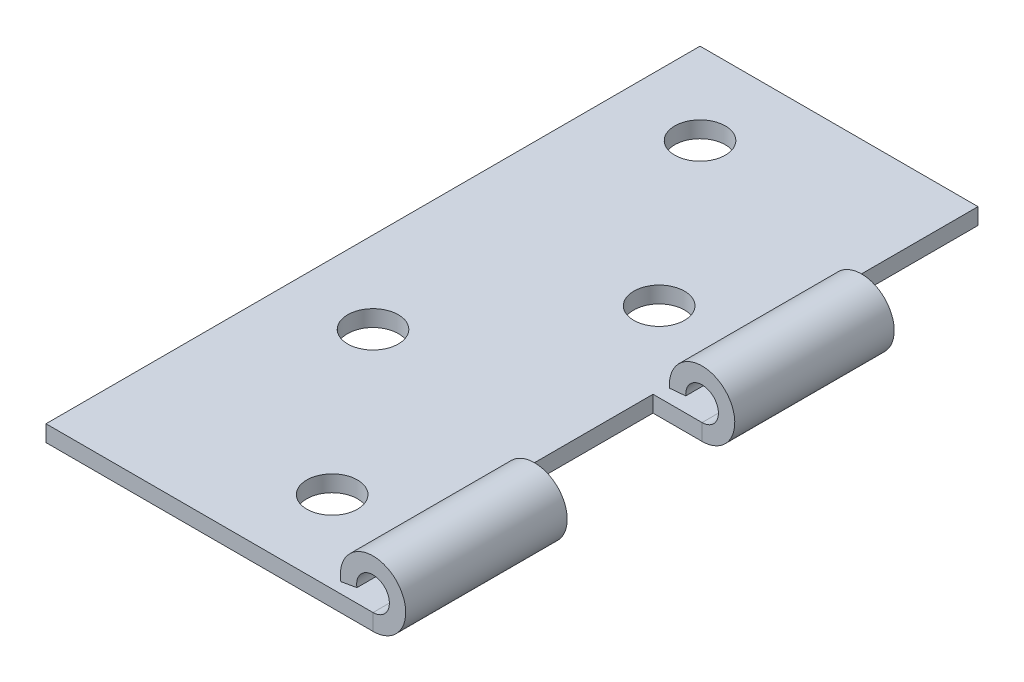
ISO-10303-21;
HEADER;
FILE_DESCRIPTION(('STEP AP214'),'2;1');
FILE_NAME('part.step','',(''),(''),'','','');
FILE_SCHEMA(('AUTOMOTIVE_DESIGN { 1 0 10303 214 1 1 1 1 }'));
ENDSEC;
DATA;
#1=APPLICATION_CONTEXT('core data for automotive mechanical design processes');
#2=APPLICATION_PROTOCOL_DEFINITION('international standard','automotive_design',2000,#1);
#3=PRODUCT_CONTEXT('',#1,'mechanical');
#4=PRODUCT('Part','Part','',(#3));
#5=PRODUCT_RELATED_PRODUCT_CATEGORY('part','',(#4));
#6=PRODUCT_DEFINITION_FORMATION('','',#4);
#7=PRODUCT_DEFINITION_CONTEXT('part definition',#1,'design');
#8=PRODUCT_DEFINITION('design','',#6,#7);
#9=PRODUCT_DEFINITION_SHAPE('','',#8);
#10=(LENGTH_UNIT() NAMED_UNIT(*) SI_UNIT(.MILLI.,.METRE.));
#11=(NAMED_UNIT(*) PLANE_ANGLE_UNIT() SI_UNIT($,.RADIAN.));
#12=(NAMED_UNIT(*) SI_UNIT($,.STERADIAN.) SOLID_ANGLE_UNIT());
#13=UNCERTAINTY_MEASURE_WITH_UNIT(LENGTH_MEASURE(1.E-05),#10,'distance_accuracy_value','');
#14=(GEOMETRIC_REPRESENTATION_CONTEXT(3) GLOBAL_UNCERTAINTY_ASSIGNED_CONTEXT((#13)) GLOBAL_UNIT_ASSIGNED_CONTEXT((#10,
#11,#12)) REPRESENTATION_CONTEXT('',''));
#15=CARTESIAN_POINT('',(0.,0.,0.));
#16=DIRECTION('',(0.,0.,1.));
#17=DIRECTION('',(1.,0.,0.));
#18=AXIS2_PLACEMENT_3D('',#15,#16,#17);
#19=CARTESIAN_POINT('',(-20.,-1.,40.));
#20=DIRECTION('',(0.,1.,0.));
#21=DIRECTION('',(0.,0.,1.));
#22=AXIS2_PLACEMENT_3D('',#19,#20,#21);
#23=PLANE('',#22);
#24=CARTESIAN_POINT('',(-10.,-1.,-30.));
#25=DIRECTION('',(0.,1.,0.));
#26=DIRECTION('',(0.,0.,1.));
#27=AXIS2_PLACEMENT_3D('',#24,#25,#26);
#28=CIRCLE('',#27,3.1);
#29=CARTESIAN_POINT('',(-10.,-1.,-26.9));
#30=VERTEX_POINT('',#29);
#31=EDGE_CURVE('E323',#30,#30,#28,.T.);
#32=ORIENTED_EDGE('',*,*,#31,.T.);
#33=EDGE_LOOP('',(#32));
#34=FACE_BOUND('',#33,.T.);
#35=CARTESIAN_POINT('',(5.,-1.,-10.));
#36=DIRECTION('',(0.,1.,0.));
#37=DIRECTION('',(0.,0.,1.));
#38=AXIS2_PLACEMENT_3D('',#35,#36,#37);
#39=CIRCLE('',#38,3.1);
#40=CARTESIAN_POINT('',(5.,-1.,-6.9));
#41=VERTEX_POINT('',#40);
#42=EDGE_CURVE('E317',#41,#41,#39,.T.);
#43=ORIENTED_EDGE('',*,*,#42,.T.);
#44=EDGE_LOOP('',(#43));
#45=FACE_BOUND('',#44,.T.);
#46=CARTESIAN_POINT('',(-10.,-1.,10.));
#47=DIRECTION('',(0.,1.,0.));
#48=DIRECTION('',(0.,0.,1.));
#49=AXIS2_PLACEMENT_3D('',#46,#47,#48);
#50=CIRCLE('',#49,3.1);
#51=CARTESIAN_POINT('',(-10.,-1.,13.1));
#52=VERTEX_POINT('',#51);
#53=EDGE_CURVE('E311',#52,#52,#50,.T.);
#54=ORIENTED_EDGE('',*,*,#53,.T.);
#55=EDGE_LOOP('',(#54));
#56=FACE_BOUND('',#55,.T.);
#57=CARTESIAN_POINT('',(5.,-1.,30.));
#58=DIRECTION('',(0.,1.,0.));
#59=DIRECTION('',(0.,0.,1.));
#60=AXIS2_PLACEMENT_3D('',#57,#58,#59);
#61=CIRCLE('',#60,3.1);
#62=CARTESIAN_POINT('',(5.,-1.,33.1));
#63=VERTEX_POINT('',#62);
#64=EDGE_CURVE('E291',#63,#63,#61,.T.);
#65=ORIENTED_EDGE('',*,*,#64,.T.);
#66=EDGE_LOOP('',(#65));
#67=FACE_BOUND('',#66,.T.);
#68=DIRECTION('',(0.,0.,1.));
#69=VECTOR('',#68,1.);
#70=CARTESIAN_POINT('',(14.,-1.,20.25));
#71=LINE('',#70,#69);
#72=CARTESIAN_POINT('',(14.,-1.,-0.249999999999999));
#73=VERTEX_POINT('',#72);
#74=CARTESIAN_POINT('',(14.,-1.,20.25));
#75=VERTEX_POINT('',#74);
#76=EDGE_CURVE('E303',#73,#75,#71,.T.);
#77=ORIENTED_EDGE('',*,*,#76,.T.);
#78=DIRECTION('',(1.,0.,0.));
#79=VECTOR('',#78,1.);
#80=CARTESIAN_POINT('',(20.,-1.,20.25));
#81=LINE('',#80,#79);
#82=CARTESIAN_POINT('',(20.,-1.,20.25));
#83=VERTEX_POINT('',#82);
#84=EDGE_CURVE('E170',#75,#83,#81,.T.);
#85=ORIENTED_EDGE('',*,*,#84,.T.);
#86=DIRECTION('',(0.,0.,-1.));
#87=VECTOR('',#86,1.);
#88=CARTESIAN_POINT('',(20.,-1.,40.));
#89=LINE('',#88,#87);
#90=CARTESIAN_POINT('',(20.,-1.,40.));
#91=VERTEX_POINT('',#90);
#92=EDGE_CURVE('E11',#91,#83,#89,.T.);
#93=ORIENTED_EDGE('',*,*,#92,.F.);
#94=DIRECTION('',(1.,0.,0.));
#95=VECTOR('',#94,1.);
#96=CARTESIAN_POINT('',(-20.,-1.,40.));
#97=LINE('',#96,#95);
#98=CARTESIAN_POINT('',(-20.,-1.,40.));
#99=VERTEX_POINT('',#98);
#100=EDGE_CURVE('E132',#99,#91,#97,.T.);
#101=ORIENTED_EDGE('',*,*,#100,.F.);
#102=DIRECTION('',(0.,0.,-1.));
#103=VECTOR('',#102,1.);
#104=CARTESIAN_POINT('',(-20.,-1.,40.));
#105=LINE('',#104,#103);
#106=CARTESIAN_POINT('',(-20.,-1.,-40.));
#107=VERTEX_POINT('',#106);
#108=EDGE_CURVE('E59',#99,#107,#105,.T.);
#109=ORIENTED_EDGE('',*,*,#108,.T.);
#110=DIRECTION('',(1.,0.,0.));
#111=VECTOR('',#110,1.);
#112=CARTESIAN_POINT('',(-20.,-1.,-40.));
#113=LINE('',#112,#111);
#114=CARTESIAN_POINT('',(14.,-1.,-40.));
#115=VERTEX_POINT('',#114);
#116=EDGE_CURVE('E109',#107,#115,#113,.T.);
#117=ORIENTED_EDGE('',*,*,#116,.T.);
#118=DIRECTION('',(0.,0.,1.));
#119=VECTOR('',#118,1.);
#120=CARTESIAN_POINT('',(14.,-1.,-40.));
#121=LINE('',#120,#119);
#122=CARTESIAN_POINT('',(14.,-1.,-19.75));
#123=VERTEX_POINT('',#122);
#124=EDGE_CURVE('E280',#115,#123,#121,.T.);
#125=ORIENTED_EDGE('',*,*,#124,.T.);
#126=DIRECTION('',(1.,0.,0.));
#127=VECTOR('',#126,1.);
#128=CARTESIAN_POINT('',(20.,-1.,-19.75));
#129=LINE('',#128,#127);
#130=CARTESIAN_POINT('',(20.,-1.,-19.75));
#131=VERTEX_POINT('',#130);
#132=EDGE_CURVE('E279',#123,#131,#129,.T.);
#133=ORIENTED_EDGE('',*,*,#132,.T.);
#134=DIRECTION('',(0.,0.,-1.));
#135=VECTOR('',#134,1.);
#136=CARTESIAN_POINT('',(20.,-1.,-19.75));
#137=LINE('',#136,#135);
#138=CARTESIAN_POINT('',(20.,-1.,-0.25));
#139=VERTEX_POINT('',#138);
#140=EDGE_CURVE('E263',#131,#139,#137,.F.);
#141=ORIENTED_EDGE('',*,*,#140,.T.);
#142=DIRECTION('',(-1.,0.,0.));
#143=VECTOR('',#142,1.);
#144=CARTESIAN_POINT('',(20.,-1.,-0.25));
#145=LINE('',#144,#143);
#146=EDGE_CURVE('E277',#139,#73,#145,.T.);
#147=ORIENTED_EDGE('',*,*,#146,.T.);
#148=EDGE_LOOP('',(#77,#85,#93,#101,#109,#117,#125,#133,#141,#147));
#149=FACE_BOUND('',#148,.T.);
#150=ADVANCED_FACE('F43',(#34,#45,#56,#67,#149),#23,.F.);
#151=CARTESIAN_POINT('',(-20.,1.,40.));
#152=DIRECTION('',(0.,1.,0.));
#153=DIRECTION('',(0.,0.,1.));
#154=AXIS2_PLACEMENT_3D('',#151,#152,#153);
#155=PLANE('',#154);
#156=CARTESIAN_POINT('',(-10.,1.,-30.));
#157=DIRECTION('',(0.,1.,0.));
#158=DIRECTION('',(0.,0.,1.));
#159=AXIS2_PLACEMENT_3D('',#156,#157,#158);
#160=CIRCLE('',#159,3.1);
#161=CARTESIAN_POINT('',(-10.,1.,-26.9));
#162=VERTEX_POINT('',#161);
#163=EDGE_CURVE('E326',#162,#162,#160,.T.);
#164=ORIENTED_EDGE('',*,*,#163,.F.);
#165=EDGE_LOOP('',(#164));
#166=FACE_BOUND('',#165,.T.);
#167=CARTESIAN_POINT('',(5.,1.,-10.));
#168=DIRECTION('',(0.,1.,0.));
#169=DIRECTION('',(0.,0.,1.));
#170=AXIS2_PLACEMENT_3D('',#167,#168,#169);
#171=CIRCLE('',#170,3.1);
#172=CARTESIAN_POINT('',(5.,1.,-6.9));
#173=VERTEX_POINT('',#172);
#174=EDGE_CURVE('E320',#173,#173,#171,.T.);
#175=ORIENTED_EDGE('',*,*,#174,.F.);
#176=EDGE_LOOP('',(#175));
#177=FACE_BOUND('',#176,.T.);
#178=CARTESIAN_POINT('',(-10.,1.,10.));
#179=DIRECTION('',(0.,1.,0.));
#180=DIRECTION('',(0.,0.,1.));
#181=AXIS2_PLACEMENT_3D('',#178,#179,#180);
#182=CIRCLE('',#181,3.1);
#183=CARTESIAN_POINT('',(-10.,1.,13.1));
#184=VERTEX_POINT('',#183);
#185=EDGE_CURVE('E314',#184,#184,#182,.T.);
#186=ORIENTED_EDGE('',*,*,#185,.F.);
#187=EDGE_LOOP('',(#186));
#188=FACE_BOUND('',#187,.T.);
#189=CARTESIAN_POINT('',(5.,1.,30.));
#190=DIRECTION('',(0.,1.,0.));
#191=DIRECTION('',(0.,0.,1.));
#192=AXIS2_PLACEMENT_3D('',#189,#190,#191);
#193=CIRCLE('',#192,3.1);
#194=CARTESIAN_POINT('',(5.,1.,33.1));
#195=VERTEX_POINT('',#194);
#196=EDGE_CURVE('E308',#195,#195,#193,.T.);
#197=ORIENTED_EDGE('',*,*,#196,.F.);
#198=EDGE_LOOP('',(#197));
#199=FACE_BOUND('',#198,.T.);
#200=DIRECTION('',(1.,0.,0.));
#201=VECTOR('',#200,1.);
#202=CARTESIAN_POINT('',(20.,1.,20.25));
#203=LINE('',#202,#201);
#204=CARTESIAN_POINT('',(14.,1.,20.25));
#205=VERTEX_POINT('',#204);
#206=CARTESIAN_POINT('',(20.,1.,20.25));
#207=VERTEX_POINT('',#206);
#208=EDGE_CURVE('E156',#205,#207,#203,.T.);
#209=ORIENTED_EDGE('',*,*,#208,.F.);
#210=DIRECTION('',(0.,0.,1.));
#211=VECTOR('',#210,1.);
#212=CARTESIAN_POINT('',(14.,1.,20.25));
#213=LINE('',#212,#211);
#214=CARTESIAN_POINT('',(14.,1.,-0.249999999999999));
#215=VERTEX_POINT('',#214);
#216=EDGE_CURVE('E297',#215,#205,#213,.T.);
#217=ORIENTED_EDGE('',*,*,#216,.F.);
#218=DIRECTION('',(-1.,0.,0.));
#219=VECTOR('',#218,1.);
#220=CARTESIAN_POINT('',(20.,1.,-0.25));
#221=LINE('',#220,#219);
#222=CARTESIAN_POINT('',(20.,1.,-0.25));
#223=VERTEX_POINT('',#222);
#224=EDGE_CURVE('E289',#223,#215,#221,.T.);
#225=ORIENTED_EDGE('',*,*,#224,.F.);
#226=DIRECTION('',(0.,0.,-1.));
#227=VECTOR('',#226,1.);
#228=CARTESIAN_POINT('',(20.,1.,-19.75));
#229=LINE('',#228,#227);
#230=CARTESIAN_POINT('',(20.,1.,-19.75));
#231=VERTEX_POINT('',#230);
#232=EDGE_CURVE('E248',#231,#223,#229,.F.);
#233=ORIENTED_EDGE('',*,*,#232,.F.);
#234=DIRECTION('',(1.,0.,0.));
#235=VECTOR('',#234,1.);
#236=CARTESIAN_POINT('',(20.,1.,-19.75));
#237=LINE('',#236,#235);
#238=CARTESIAN_POINT('',(14.,1.,-19.75));
#239=VERTEX_POINT('',#238);
#240=EDGE_CURVE('E218',#239,#231,#237,.T.);
#241=ORIENTED_EDGE('',*,*,#240,.F.);
#242=DIRECTION('',(0.,0.,1.));
#243=VECTOR('',#242,1.);
#244=CARTESIAN_POINT('',(14.,1.,-40.));
#245=LINE('',#244,#243);
#246=CARTESIAN_POINT('',(14.,1.,-40.));
#247=VERTEX_POINT('',#246);
#248=EDGE_CURVE('E286',#247,#239,#245,.T.);
#249=ORIENTED_EDGE('',*,*,#248,.F.);
#250=DIRECTION('',(1.,0.,0.));
#251=VECTOR('',#250,1.);
#252=CARTESIAN_POINT('',(-20.,1.,-40.));
#253=LINE('',#252,#251);
#254=CARTESIAN_POINT('',(-20.,1.,-40.));
#255=VERTEX_POINT('',#254);
#256=EDGE_CURVE('E144',#255,#247,#253,.T.);
#257=ORIENTED_EDGE('',*,*,#256,.F.);
#258=DIRECTION('',(0.,0.,-1.));
#259=VECTOR('',#258,1.);
#260=CARTESIAN_POINT('',(-20.,1.,40.));
#261=LINE('',#260,#259);
#262=CARTESIAN_POINT('',(-20.,1.,40.));
#263=VERTEX_POINT('',#262);
#264=EDGE_CURVE('E67',#263,#255,#261,.T.);
#265=ORIENTED_EDGE('',*,*,#264,.F.);
#266=DIRECTION('',(1.,0.,0.));
#267=VECTOR('',#266,1.);
#268=CARTESIAN_POINT('',(-20.,1.,40.));
#269=LINE('',#268,#267);
#270=CARTESIAN_POINT('',(20.,0.999999999999998,40.));
#271=VERTEX_POINT('',#270);
#272=EDGE_CURVE('E137',#263,#271,#269,.T.);
#273=ORIENTED_EDGE('',*,*,#272,.T.);
#274=DIRECTION('',(0.,0.,-1.));
#275=VECTOR('',#274,1.);
#276=CARTESIAN_POINT('',(20.,1.,40.));
#277=LINE('',#276,#275);
#278=EDGE_CURVE('E51',#271,#207,#277,.T.);
#279=ORIENTED_EDGE('',*,*,#278,.T.);
#280=EDGE_LOOP('',(#209,#217,#225,#233,#241,#249,#257,#265,#273,#279));
#281=FACE_BOUND('',#280,.T.);
#282=ADVANCED_FACE('F152',(#166,#177,#188,#199,#281),#155,.T.);
#283=CARTESIAN_POINT('',(-20.,-1.,40.));
#284=DIRECTION('',(-1.,0.,0.));
#285=DIRECTION('',(0.,0.,1.));
#286=AXIS2_PLACEMENT_3D('',#283,#284,#285);
#287=PLANE('',#286);
#288=DIRECTION('',(0.,1.,0.));
#289=VECTOR('',#288,1.);
#290=CARTESIAN_POINT('',(-20.,-1.,-40.));
#291=LINE('',#290,#289);
#292=EDGE_CURVE('E135',#107,#255,#291,.T.);
#293=ORIENTED_EDGE('',*,*,#292,.F.);
#294=ORIENTED_EDGE('',*,*,#108,.F.);
#295=DIRECTION('',(0.,1.,0.));
#296=VECTOR('',#295,1.);
#297=CARTESIAN_POINT('',(-20.,-1.,40.));
#298=LINE('',#297,#296);
#299=EDGE_CURVE('E140',#99,#263,#298,.T.);
#300=ORIENTED_EDGE('',*,*,#299,.T.);
#301=ORIENTED_EDGE('',*,*,#264,.T.);
#302=EDGE_LOOP('',(#293,#294,#300,#301));
#303=FACE_BOUND('',#302,.T.);
#304=ADVANCED_FACE('F334',(#303),#287,.T.);
#305=CARTESIAN_POINT('',(0.,0.,40.));
#306=DIRECTION('',(0.,0.,-1.));
#307=DIRECTION('',(-1.,0.,0.));
#308=AXIS2_PLACEMENT_3D('',#305,#306,#307);
#309=PLANE('',#308);
#310=ORIENTED_EDGE('',*,*,#100,.T.);
#311=DIRECTION('',(0.,-1.,0.));
#312=VECTOR('',#311,1.);
#313=CARTESIAN_POINT('',(20.,1.,40.));
#314=LINE('',#313,#312);
#315=EDGE_CURVE('E76',#271,#91,#314,.T.);
#316=ORIENTED_EDGE('',*,*,#315,.F.);
#317=ORIENTED_EDGE('',*,*,#272,.F.);
#318=ORIENTED_EDGE('',*,*,#299,.F.);
#319=EDGE_LOOP('',(#310,#316,#317,#318));
#320=FACE_BOUND('',#319,.T.);
#321=ADVANCED_FACE('F162',(#320),#309,.F.);
#322=CARTESIAN_POINT('',(0.,0.,-40.));
#323=DIRECTION('',(0.,0.,-1.));
#324=DIRECTION('',(-1.,0.,0.));
#325=AXIS2_PLACEMENT_3D('',#322,#323,#324);
#326=PLANE('',#325);
#327=DIRECTION('',(0.,1.,0.));
#328=VECTOR('',#327,1.);
#329=CARTESIAN_POINT('',(14.,-1.,-40.));
#330=LINE('',#329,#328);
#331=EDGE_CURVE('E281',#115,#247,#330,.T.);
#332=ORIENTED_EDGE('',*,*,#331,.F.);
#333=ORIENTED_EDGE('',*,*,#116,.F.);
#334=ORIENTED_EDGE('',*,*,#292,.T.);
#335=ORIENTED_EDGE('',*,*,#256,.T.);
#336=EDGE_LOOP('',(#332,#333,#334,#335));
#337=FACE_BOUND('',#336,.T.);
#338=ADVANCED_FACE('F535',(#337),#326,.T.);
#339=CARTESIAN_POINT('',(18.0303844939756,2.65270364466612,30.125));
#340=DIRECTION('',(-0.173648177666941,0.984807753012206,0.));
#341=DIRECTION('',(0.,0.,-1.));
#342=AXIS2_PLACEMENT_3D('',#339,#340,#341);
#343=PLANE('',#342);
#344=DIRECTION('',(-0.984807753012206,-0.173648177666941,0.));
#345=VECTOR('',#344,1.);
#346=CARTESIAN_POINT('',(18.0303844939756,2.65270364466612,20.25));
#347=LINE('',#346,#345);
#348=CARTESIAN_POINT('',(18.0303844939756,2.65270364466612,20.25));
#349=VERTEX_POINT('',#348);
#350=CARTESIAN_POINT('',(16.0607689879512,2.30540728933223,20.25));
#351=VERTEX_POINT('',#350);
#352=EDGE_CURVE('E98',#349,#351,#347,.T.);
#353=ORIENTED_EDGE('',*,*,#352,.F.);
#354=DIRECTION('',(0.,0.,-1.));
#355=VECTOR('',#354,1.);
#356=CARTESIAN_POINT('',(18.0303844939756,2.65270364466612,20.25));
#357=LINE('',#356,#355);
#358=CARTESIAN_POINT('',(18.0303844939756,2.65270364466612,40.));
#359=VERTEX_POINT('',#358);
#360=EDGE_CURVE('E101',#359,#349,#357,.T.);
#361=ORIENTED_EDGE('',*,*,#360,.F.);
#362=DIRECTION('',(-0.984807753012206,-0.173648177666941,0.));
#363=VECTOR('',#362,1.);
#364=CARTESIAN_POINT('',(18.0303844939756,2.65270364466612,40.));
#365=LINE('',#364,#363);
#366=CARTESIAN_POINT('',(16.0607689879512,2.30540728933223,40.));
#367=VERTEX_POINT('',#366);
#368=EDGE_CURVE('E110',#359,#367,#365,.T.);
#369=ORIENTED_EDGE('',*,*,#368,.T.);
#370=DIRECTION('',(0.,0.,-1.));
#371=VECTOR('',#370,1.);
#372=CARTESIAN_POINT('',(16.0607689879512,2.30540728933223,20.25));
#373=LINE('',#372,#371);
#374=EDGE_CURVE('E104',#367,#351,#373,.T.);
#375=ORIENTED_EDGE('',*,*,#374,.T.);
#376=EDGE_LOOP('',(#353,#361,#369,#375));
#377=FACE_BOUND('',#376,.T.);
#378=ADVANCED_FACE('F100',(#377),#343,.F.);
#379=CARTESIAN_POINT('',(20.,3.,40.));
#380=DIRECTION('',(0.,0.,1.));
#381=DIRECTION('',(1.,0.,0.));
#382=AXIS2_PLACEMENT_3D('',#379,#380,#381);
#383=PLANE('',#382);
#384=ORIENTED_EDGE('',*,*,#368,.F.);
#385=CARTESIAN_POINT('',(20.,3.,40.));
#386=DIRECTION('',(0.,0.,-1.));
#387=DIRECTION('',(-1.,0.,0.));
#388=AXIS2_PLACEMENT_3D('',#385,#386,#387);
#389=CIRCLE('',#388,2.);
#390=EDGE_CURVE('E118',#271,#359,#389,.F.);
#391=ORIENTED_EDGE('',*,*,#390,.F.);
#392=ORIENTED_EDGE('',*,*,#315,.T.);
#393=CARTESIAN_POINT('',(20.,3.,40.));
#394=DIRECTION('',(0.,0.,-1.));
#395=DIRECTION('',(-1.,0.,0.));
#396=AXIS2_PLACEMENT_3D('',#393,#394,#395);
#397=CIRCLE('',#396,4.);
#398=EDGE_CURVE('E131',#91,#367,#397,.F.);
#399=ORIENTED_EDGE('',*,*,#398,.T.);
#400=EDGE_LOOP('',(#384,#391,#392,#399));
#401=FACE_BOUND('',#400,.T.);
#402=ADVANCED_FACE('F160',(#401),#383,.T.);
#403=CARTESIAN_POINT('',(20.,3.,20.25));
#404=DIRECTION('',(0.,0.,1.));
#405=DIRECTION('',(1.,0.,0.));
#406=AXIS2_PLACEMENT_3D('',#403,#404,#405);
#407=PLANE('',#406);
#408=CARTESIAN_POINT('',(20.,3.,20.25));
#409=DIRECTION('',(0.,0.,-1.));
#410=DIRECTION('',(-1.,0.,0.));
#411=AXIS2_PLACEMENT_3D('',#408,#409,#410);
#412=CIRCLE('',#411,2.);
#413=EDGE_CURVE('E116',#349,#207,#412,.T.);
#414=ORIENTED_EDGE('',*,*,#413,.F.);
#415=ORIENTED_EDGE('',*,*,#352,.T.);
#416=CARTESIAN_POINT('',(20.,3.,20.25));
#417=DIRECTION('',(0.,0.,-1.));
#418=DIRECTION('',(-1.,0.,0.));
#419=AXIS2_PLACEMENT_3D('',#416,#417,#418);
#420=CIRCLE('',#419,4.);
#421=EDGE_CURVE('E173',#351,#83,#420,.T.);
#422=ORIENTED_EDGE('',*,*,#421,.T.);
#423=DIRECTION('',(0.,-1.,0.));
#424=VECTOR('',#423,1.);
#425=CARTESIAN_POINT('',(20.,0.999999999999998,20.25));
#426=LINE('',#425,#424);
#427=EDGE_CURVE('E124',#207,#83,#426,.T.);
#428=ORIENTED_EDGE('',*,*,#427,.F.);
#429=EDGE_LOOP('',(#414,#415,#422,#428));
#430=FACE_BOUND('',#429,.T.);
#431=ADVANCED_FACE('F122',(#430),#407,.F.);
#432=CARTESIAN_POINT('',(20.,3.,20.25));
#433=DIRECTION('',(0.,0.,-1.));
#434=DIRECTION('',(-0.984807753012206,-0.173648177666941,0.));
#435=AXIS2_PLACEMENT_3D('',#432,#433,#434);
#436=CYLINDRICAL_SURFACE('',#435,4.);
#437=ORIENTED_EDGE('',*,*,#92,.T.);
#438=ORIENTED_EDGE('',*,*,#421,.F.);
#439=ORIENTED_EDGE('',*,*,#374,.F.);
#440=ORIENTED_EDGE('',*,*,#398,.F.);
#441=EDGE_LOOP('',(#437,#438,#439,#440));
#442=FACE_BOUND('',#441,.T.);
#443=ADVANCED_FACE('F172',(#442),#436,.T.);
#444=CARTESIAN_POINT('',(20.,3.,20.25));
#445=DIRECTION('',(0.,0.,-1.));
#446=DIRECTION('',(-0.984807753012206,-0.173648177666941,0.));
#447=AXIS2_PLACEMENT_3D('',#444,#445,#446);
#448=CYLINDRICAL_SURFACE('',#447,2.);
#449=ORIENTED_EDGE('',*,*,#278,.F.);
#450=ORIENTED_EDGE('',*,*,#390,.T.);
#451=ORIENTED_EDGE('',*,*,#360,.T.);
#452=ORIENTED_EDGE('',*,*,#413,.T.);
#453=EDGE_LOOP('',(#449,#450,#451,#452));
#454=FACE_BOUND('',#453,.T.);
#455=ADVANCED_FACE('F114',(#454),#448,.F.);
#456=CARTESIAN_POINT('',(18.0076106038165,2.82568851450466,-10.));
#457=DIRECTION('',(-0.0871557427476685,0.996194698091745,0.));
#458=DIRECTION('',(0.,0.,-1.));
#459=AXIS2_PLACEMENT_3D('',#456,#457,#458);
#460=PLANE('',#459);
#461=DIRECTION('',(-0.996194698091745,-0.0871557427476685,0.));
#462=VECTOR('',#461,1.);
#463=CARTESIAN_POINT('',(18.0076106038165,2.82568851450466,-19.75));
#464=LINE('',#463,#462);
#465=CARTESIAN_POINT('',(18.0076106038165,2.82568851450466,-19.75));
#466=VERTEX_POINT('',#465);
#467=CARTESIAN_POINT('',(16.015221207633,2.65137702900933,-19.75));
#468=VERTEX_POINT('',#467);
#469=EDGE_CURVE('E119',#466,#468,#464,.T.);
#470=ORIENTED_EDGE('',*,*,#469,.F.);
#471=DIRECTION('',(0.,0.,-1.));
#472=VECTOR('',#471,1.);
#473=CARTESIAN_POINT('',(18.0076106038165,2.82568851450466,-19.75));
#474=LINE('',#473,#472);
#475=CARTESIAN_POINT('',(18.0076106038165,2.82568851450466,-0.25));
#476=VERTEX_POINT('',#475);
#477=EDGE_CURVE('E226',#476,#466,#474,.T.);
#478=ORIENTED_EDGE('',*,*,#477,.F.);
#479=DIRECTION('',(-0.996194698091745,-0.0871557427476685,0.));
#480=VECTOR('',#479,1.);
#481=CARTESIAN_POINT('',(18.0076106038165,2.82568851450466,-0.25));
#482=LINE('',#481,#480);
#483=CARTESIAN_POINT('',(16.015221207633,2.65137702900933,-0.25));
#484=VERTEX_POINT('',#483);
#485=EDGE_CURVE('E234',#476,#484,#482,.T.);
#486=ORIENTED_EDGE('',*,*,#485,.T.);
#487=DIRECTION('',(0.,0.,-1.));
#488=VECTOR('',#487,1.);
#489=CARTESIAN_POINT('',(16.015221207633,2.65137702900933,-19.75));
#490=LINE('',#489,#488);
#491=EDGE_CURVE('E229',#484,#468,#490,.T.);
#492=ORIENTED_EDGE('',*,*,#491,.T.);
#493=EDGE_LOOP('',(#470,#478,#486,#492));
#494=FACE_BOUND('',#493,.T.);
#495=ADVANCED_FACE('F225',(#494),#460,.F.);
#496=CARTESIAN_POINT('',(20.,3.,-0.25));
#497=DIRECTION('',(0.,0.,1.));
#498=DIRECTION('',(1.,0.,0.));
#499=AXIS2_PLACEMENT_3D('',#496,#497,#498);
#500=PLANE('',#499);
#501=ORIENTED_EDGE('',*,*,#485,.F.);
#502=CARTESIAN_POINT('',(20.,3.,-0.25));
#503=DIRECTION('',(0.,0.,-1.));
#504=DIRECTION('',(-1.,0.,0.));
#505=AXIS2_PLACEMENT_3D('',#502,#503,#504);
#506=CIRCLE('',#505,2.);
#507=EDGE_CURVE('E243',#223,#476,#506,.F.);
#508=ORIENTED_EDGE('',*,*,#507,.F.);
#509=DIRECTION('',(0.,-1.,0.));
#510=VECTOR('',#509,1.);
#511=CARTESIAN_POINT('',(20.,1.,-0.25));
#512=LINE('',#511,#510);
#513=EDGE_CURVE('E253',#223,#139,#512,.T.);
#514=ORIENTED_EDGE('',*,*,#513,.T.);
#515=CARTESIAN_POINT('',(20.,3.,-0.25));
#516=DIRECTION('',(0.,0.,-1.));
#517=DIRECTION('',(-1.,0.,0.));
#518=AXIS2_PLACEMENT_3D('',#515,#516,#517);
#519=CIRCLE('',#518,4.);
#520=EDGE_CURVE('E258',#139,#484,#519,.F.);
#521=ORIENTED_EDGE('',*,*,#520,.T.);
#522=EDGE_LOOP('',(#501,#508,#514,#521));
#523=FACE_BOUND('',#522,.T.);
#524=ADVANCED_FACE('F470',(#523),#500,.T.);
#525=CARTESIAN_POINT('',(20.,3.,-19.75));
#526=DIRECTION('',(0.,0.,1.));
#527=DIRECTION('',(1.,0.,0.));
#528=AXIS2_PLACEMENT_3D('',#525,#526,#527);
#529=PLANE('',#528);
#530=CARTESIAN_POINT('',(20.,3.,-19.75));
#531=DIRECTION('',(0.,0.,-1.));
#532=DIRECTION('',(-1.,0.,0.));
#533=AXIS2_PLACEMENT_3D('',#530,#531,#532);
#534=CIRCLE('',#533,2.);
#535=EDGE_CURVE('E240',#466,#231,#534,.T.);
#536=ORIENTED_EDGE('',*,*,#535,.F.);
#537=ORIENTED_EDGE('',*,*,#469,.T.);
#538=CARTESIAN_POINT('',(20.,3.,-19.75));
#539=DIRECTION('',(0.,0.,-1.));
#540=DIRECTION('',(-1.,0.,0.));
#541=AXIS2_PLACEMENT_3D('',#538,#539,#540);
#542=CIRCLE('',#541,4.);
#543=EDGE_CURVE('E268',#468,#131,#542,.T.);
#544=ORIENTED_EDGE('',*,*,#543,.T.);
#545=DIRECTION('',(0.,-1.,0.));
#546=VECTOR('',#545,1.);
#547=CARTESIAN_POINT('',(20.,1.,-19.75));
#548=LINE('',#547,#546);
#549=EDGE_CURVE('E247',#231,#131,#548,.T.);
#550=ORIENTED_EDGE('',*,*,#549,.F.);
#551=EDGE_LOOP('',(#536,#537,#544,#550));
#552=FACE_BOUND('',#551,.T.);
#553=ADVANCED_FACE('F246',(#552),#529,.F.);
#554=CARTESIAN_POINT('',(20.,3.,-19.75));
#555=DIRECTION('',(0.,0.,-1.));
#556=DIRECTION('',(-0.996194698091745,-0.0871557427476685,0.));
#557=AXIS2_PLACEMENT_3D('',#554,#555,#556);
#558=CYLINDRICAL_SURFACE('',#557,4.);
#559=ORIENTED_EDGE('',*,*,#140,.F.);
#560=ORIENTED_EDGE('',*,*,#543,.F.);
#561=ORIENTED_EDGE('',*,*,#491,.F.);
#562=ORIENTED_EDGE('',*,*,#520,.F.);
#563=EDGE_LOOP('',(#559,#560,#561,#562));
#564=FACE_BOUND('',#563,.T.);
#565=ADVANCED_FACE('F275',(#564),#558,.T.);
#566=CARTESIAN_POINT('',(20.,3.,-19.75));
#567=DIRECTION('',(0.,0.,-1.));
#568=DIRECTION('',(-0.996194698091745,-0.0871557427476685,0.));
#569=AXIS2_PLACEMENT_3D('',#566,#567,#568);
#570=CYLINDRICAL_SURFACE('',#569,2.);
#571=ORIENTED_EDGE('',*,*,#232,.T.);
#572=ORIENTED_EDGE('',*,*,#507,.T.);
#573=ORIENTED_EDGE('',*,*,#477,.T.);
#574=ORIENTED_EDGE('',*,*,#535,.T.);
#575=EDGE_LOOP('',(#571,#572,#573,#574));
#576=FACE_BOUND('',#575,.T.);
#577=ADVANCED_FACE('F239',(#576),#570,.F.);
#578=CARTESIAN_POINT('',(20.,-1.,-19.75));
#579=DIRECTION('',(0.,0.,1.));
#580=DIRECTION('',(1.,0.,0.));
#581=AXIS2_PLACEMENT_3D('',#578,#579,#580);
#582=PLANE('',#581);
#583=ORIENTED_EDGE('',*,*,#240,.T.);
#584=ORIENTED_EDGE('',*,*,#549,.T.);
#585=ORIENTED_EDGE('',*,*,#132,.F.);
#586=DIRECTION('',(0.,1.,0.));
#587=VECTOR('',#586,1.);
#588=CARTESIAN_POINT('',(14.,-1.,-19.75));
#589=LINE('',#588,#587);
#590=EDGE_CURVE('E283',#123,#239,#589,.T.);
#591=ORIENTED_EDGE('',*,*,#590,.T.);
#592=EDGE_LOOP('',(#583,#584,#585,#591));
#593=FACE_BOUND('',#592,.T.);
#594=ADVANCED_FACE('F432',(#593),#582,.F.);
#595=CARTESIAN_POINT('',(14.,-1.,-40.));
#596=DIRECTION('',(-1.,0.,0.));
#597=DIRECTION('',(0.,0.,1.));
#598=AXIS2_PLACEMENT_3D('',#595,#596,#597);
#599=PLANE('',#598);
#600=ORIENTED_EDGE('',*,*,#248,.T.);
#601=ORIENTED_EDGE('',*,*,#590,.F.);
#602=ORIENTED_EDGE('',*,*,#124,.F.);
#603=ORIENTED_EDGE('',*,*,#331,.T.);
#604=EDGE_LOOP('',(#600,#601,#602,#603));
#605=FACE_BOUND('',#604,.T.);
#606=ADVANCED_FACE('F423',(#605),#599,.F.);
#607=CARTESIAN_POINT('',(20.,-1.,20.25));
#608=DIRECTION('',(0.,0.,1.));
#609=DIRECTION('',(1.,0.,0.));
#610=AXIS2_PLACEMENT_3D('',#607,#608,#609);
#611=PLANE('',#610);
#612=ORIENTED_EDGE('',*,*,#208,.T.);
#613=ORIENTED_EDGE('',*,*,#427,.T.);
#614=ORIENTED_EDGE('',*,*,#84,.F.);
#615=DIRECTION('',(0.,1.,0.));
#616=VECTOR('',#615,1.);
#617=CARTESIAN_POINT('',(14.,-1.,20.25));
#618=LINE('',#617,#616);
#619=EDGE_CURVE('E244',#75,#205,#618,.T.);
#620=ORIENTED_EDGE('',*,*,#619,.T.);
#621=EDGE_LOOP('',(#612,#613,#614,#620));
#622=FACE_BOUND('',#621,.T.);
#623=ADVANCED_FACE('F412',(#622),#611,.F.);
#624=CARTESIAN_POINT('',(14.,-1.,20.25));
#625=DIRECTION('',(-1.,0.,0.));
#626=DIRECTION('',(0.,0.,1.));
#627=AXIS2_PLACEMENT_3D('',#624,#625,#626);
#628=PLANE('',#627);
#629=ORIENTED_EDGE('',*,*,#216,.T.);
#630=ORIENTED_EDGE('',*,*,#619,.F.);
#631=ORIENTED_EDGE('',*,*,#76,.F.);
#632=DIRECTION('',(0.,1.,0.));
#633=VECTOR('',#632,1.);
#634=CARTESIAN_POINT('',(14.,-1.,-0.249999999999999));
#635=LINE('',#634,#633);
#636=EDGE_CURVE('E293',#73,#215,#635,.T.);
#637=ORIENTED_EDGE('',*,*,#636,.T.);
#638=EDGE_LOOP('',(#629,#630,#631,#637));
#639=FACE_BOUND('',#638,.T.);
#640=ADVANCED_FACE('F354',(#639),#628,.F.);
#641=CARTESIAN_POINT('',(20.,-1.,-0.25));
#642=DIRECTION('',(0.,0.,-1.));
#643=DIRECTION('',(-1.,0.,0.));
#644=AXIS2_PLACEMENT_3D('',#641,#642,#643);
#645=PLANE('',#644);
#646=ORIENTED_EDGE('',*,*,#224,.T.);
#647=ORIENTED_EDGE('',*,*,#636,.F.);
#648=ORIENTED_EDGE('',*,*,#146,.F.);
#649=ORIENTED_EDGE('',*,*,#513,.F.);
#650=EDGE_LOOP('',(#646,#647,#648,#649));
#651=FACE_BOUND('',#650,.T.);
#652=ADVANCED_FACE('F344',(#651),#645,.F.);
#653=CARTESIAN_POINT('',(5.,1.,30.));
#654=DIRECTION('',(0.,1.,0.));
#655=DIRECTION('',(0.,0.,1.));
#656=AXIS2_PLACEMENT_3D('',#653,#654,#655);
#657=CYLINDRICAL_SURFACE('',#656,3.1);
#658=ORIENTED_EDGE('',*,*,#64,.F.);
#659=EDGE_LOOP('',(#658));
#660=FACE_BOUND('',#659,.T.);
#661=ORIENTED_EDGE('',*,*,#196,.T.);
#662=EDGE_LOOP('',(#661));
#663=FACE_BOUND('',#662,.T.);
#664=ADVANCED_FACE('F341',(#660,#663),#657,.F.);
#665=CARTESIAN_POINT('',(-10.,1.,10.));
#666=DIRECTION('',(0.,1.,0.));
#667=DIRECTION('',(0.,0.,1.));
#668=AXIS2_PLACEMENT_3D('',#665,#666,#667);
#669=CYLINDRICAL_SURFACE('',#668,3.1);
#670=ORIENTED_EDGE('',*,*,#53,.F.);
#671=EDGE_LOOP('',(#670));
#672=FACE_BOUND('',#671,.T.);
#673=ORIENTED_EDGE('',*,*,#185,.T.);
#674=EDGE_LOOP('',(#673));
#675=FACE_BOUND('',#674,.T.);
#676=ADVANCED_FACE('F343',(#672,#675),#669,.F.);
#677=CARTESIAN_POINT('',(5.,1.,-10.));
#678=DIRECTION('',(0.,1.,0.));
#679=DIRECTION('',(0.,0.,1.));
#680=AXIS2_PLACEMENT_3D('',#677,#678,#679);
#681=CYLINDRICAL_SURFACE('',#680,3.1);
#682=ORIENTED_EDGE('',*,*,#42,.F.);
#683=EDGE_LOOP('',(#682));
#684=FACE_BOUND('',#683,.T.);
#685=ORIENTED_EDGE('',*,*,#174,.T.);
#686=EDGE_LOOP('',(#685));
#687=FACE_BOUND('',#686,.T.);
#688=ADVANCED_FACE('F350',(#684,#687),#681,.F.);
#689=CARTESIAN_POINT('',(-10.,1.,-30.));
#690=DIRECTION('',(0.,1.,0.));
#691=DIRECTION('',(0.,0.,1.));
#692=AXIS2_PLACEMENT_3D('',#689,#690,#691);
#693=CYLINDRICAL_SURFACE('',#692,3.1);
#694=ORIENTED_EDGE('',*,*,#31,.F.);
#695=EDGE_LOOP('',(#694));
#696=FACE_BOUND('',#695,.T.);
#697=ORIENTED_EDGE('',*,*,#163,.T.);
#698=EDGE_LOOP('',(#697));
#699=FACE_BOUND('',#698,.T.);
#700=ADVANCED_FACE('F330',(#696,#699),#693,.F.);
#701=CLOSED_SHELL('',(#150,#282,#304,#321,#338,#378,#402,#431,#443,#455,#495,#524,#553,#565,
#577,#594,#606,#623,#640,#652,#664,#676,#688,#700));
#702=MANIFOLD_SOLID_BREP('B2',#701);
#703=ADVANCED_BREP_SHAPE_REPRESENTATION('',(#18,#702),#14);
#704=SHAPE_DEFINITION_REPRESENTATION(#9,#703);
ENDSEC;
END-ISO-10303-21;
